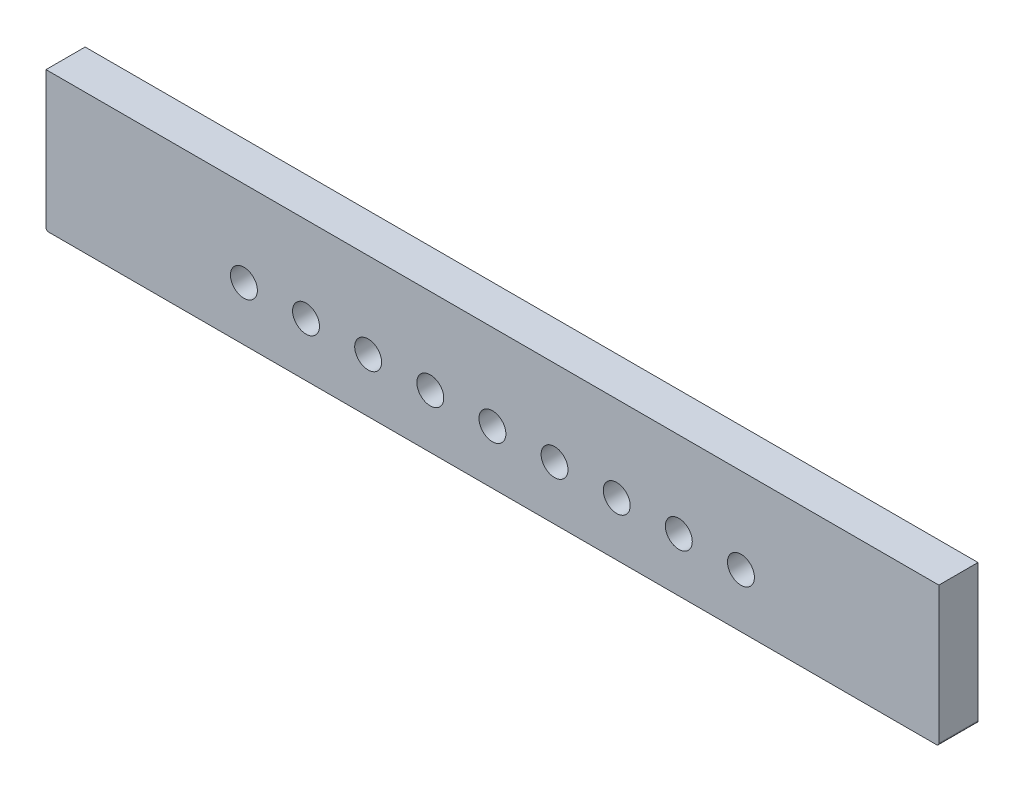
ISO-10303-21;
HEADER;
FILE_DESCRIPTION(('STEP AP214'),'2;1');
FILE_NAME('part.step','',(''),(''),'','','');
FILE_SCHEMA(('AUTOMOTIVE_DESIGN { 1 0 10303 214 1 1 1 1 }'));
ENDSEC;
DATA;
#1=APPLICATION_CONTEXT('core data for automotive mechanical design processes');
#2=APPLICATION_PROTOCOL_DEFINITION('international standard','automotive_design',2000,#1);
#3=PRODUCT_CONTEXT('',#1,'mechanical');
#4=PRODUCT('Part','Part','',(#3));
#5=PRODUCT_RELATED_PRODUCT_CATEGORY('part','',(#4));
#6=PRODUCT_DEFINITION_FORMATION('','',#4);
#7=PRODUCT_DEFINITION_CONTEXT('part definition',#1,'design');
#8=PRODUCT_DEFINITION('design','',#6,#7);
#9=PRODUCT_DEFINITION_SHAPE('','',#8);
#10=(LENGTH_UNIT() NAMED_UNIT(*) SI_UNIT(.MILLI.,.METRE.));
#11=(NAMED_UNIT(*) PLANE_ANGLE_UNIT() SI_UNIT($,.RADIAN.));
#12=(NAMED_UNIT(*) SI_UNIT($,.STERADIAN.) SOLID_ANGLE_UNIT());
#13=UNCERTAINTY_MEASURE_WITH_UNIT(LENGTH_MEASURE(1.E-05),#10,'distance_accuracy_value','');
#14=(GEOMETRIC_REPRESENTATION_CONTEXT(3) GLOBAL_UNCERTAINTY_ASSIGNED_CONTEXT((#13)) GLOBAL_UNIT_ASSIGNED_CONTEXT((#10,
#11,#12)) REPRESENTATION_CONTEXT('',''));
#15=CARTESIAN_POINT('',(0.,0.,0.));
#16=DIRECTION('',(0.,0.,1.));
#17=DIRECTION('',(1.,0.,0.));
#18=AXIS2_PLACEMENT_3D('',#15,#16,#17);
#19=CARTESIAN_POINT('',(-10.16,-35.4,-1.4));
#20=DIRECTION('',(0.,0.,1.));
#21=DIRECTION('',(1.,0.,0.));
#22=AXIS2_PLACEMENT_3D('',#19,#20,#21);
#23=CYLINDRICAL_SURFACE('',#22,0.55);
#24=DIRECTION('',(0.,0.,-1.));
#25=VECTOR('',#24,1.);
#26=CARTESIAN_POINT('',(-9.61,-35.4,-1.4));
#27=LINE('',#26,#25);
#28=CARTESIAN_POINT('',(-9.61,-35.4,-1.4));
#29=VERTEX_POINT('',#28);
#30=CARTESIAN_POINT('',(-9.61,-35.4,-3.));
#31=VERTEX_POINT('',#30);
#32=EDGE_CURVE('E11',#29,#31,#27,.T.);
#33=ORIENTED_EDGE('',*,*,#32,.T.);
#34=CARTESIAN_POINT('',(-10.16,-35.4,-3.));
#35=DIRECTION('',(0.,0.,1.));
#36=DIRECTION('',(1.,0.,0.));
#37=AXIS2_PLACEMENT_3D('',#34,#35,#36);
#38=CIRCLE('',#37,0.55);
#39=EDGE_CURVE('E232',#31,#31,#38,.T.);
#40=ORIENTED_EDGE('',*,*,#39,.F.);
#41=ORIENTED_EDGE('',*,*,#32,.F.);
#42=CARTESIAN_POINT('',(-10.16,-35.4,-1.4));
#43=DIRECTION('',(0.,0.,1.));
#44=DIRECTION('',(1.,0.,0.));
#45=AXIS2_PLACEMENT_3D('',#42,#43,#44);
#46=CIRCLE('',#45,0.55);
#47=EDGE_CURVE('E207',#29,#29,#46,.T.);
#48=ORIENTED_EDGE('',*,*,#47,.T.);
#49=EDGE_LOOP('',(#33,#40,#41,#48));
#50=FACE_BOUND('',#49,.T.);
#51=ADVANCED_FACE('F16',(#50),#23,.F.);
#52=CARTESIAN_POINT('',(-7.62,-35.4,-1.4));
#53=DIRECTION('',(0.,0.,1.));
#54=DIRECTION('',(1.,0.,0.));
#55=AXIS2_PLACEMENT_3D('',#52,#53,#54);
#56=CYLINDRICAL_SURFACE('',#55,0.55);
#57=DIRECTION('',(0.,0.,-1.));
#58=VECTOR('',#57,1.);
#59=CARTESIAN_POINT('',(-7.07,-35.4,-1.4));
#60=LINE('',#59,#58);
#61=CARTESIAN_POINT('',(-7.07,-35.4,-1.4));
#62=VERTEX_POINT('',#61);
#63=CARTESIAN_POINT('',(-7.07,-35.4,-3.));
#64=VERTEX_POINT('',#63);
#65=EDGE_CURVE('E27',#62,#64,#60,.T.);
#66=ORIENTED_EDGE('',*,*,#65,.T.);
#67=CARTESIAN_POINT('',(-7.62,-35.4,-3.));
#68=DIRECTION('',(0.,0.,1.));
#69=DIRECTION('',(1.,0.,0.));
#70=AXIS2_PLACEMENT_3D('',#67,#68,#69);
#71=CIRCLE('',#70,0.55);
#72=EDGE_CURVE('E201',#64,#64,#71,.T.);
#73=ORIENTED_EDGE('',*,*,#72,.F.);
#74=ORIENTED_EDGE('',*,*,#65,.F.);
#75=CARTESIAN_POINT('',(-7.62,-35.4,-1.4));
#76=DIRECTION('',(0.,0.,1.));
#77=DIRECTION('',(1.,0.,0.));
#78=AXIS2_PLACEMENT_3D('',#75,#76,#77);
#79=CIRCLE('',#78,0.55);
#80=EDGE_CURVE('E203',#62,#62,#79,.T.);
#81=ORIENTED_EDGE('',*,*,#80,.T.);
#82=EDGE_LOOP('',(#66,#73,#74,#81));
#83=FACE_BOUND('',#82,.T.);
#84=ADVANCED_FACE('F600',(#83),#56,.F.);
#85=CARTESIAN_POINT('',(7.62,-35.4,-1.4));
#86=DIRECTION('',(0.,0.,1.));
#87=DIRECTION('',(1.,0.,0.));
#88=AXIS2_PLACEMENT_3D('',#85,#86,#87);
#89=CYLINDRICAL_SURFACE('',#88,0.55);
#90=DIRECTION('',(0.,0.,-1.));
#91=VECTOR('',#90,1.);
#92=CARTESIAN_POINT('',(8.17,-35.4,-1.4));
#93=LINE('',#92,#91);
#94=CARTESIAN_POINT('',(8.17,-35.4,-1.4));
#95=VERTEX_POINT('',#94);
#96=CARTESIAN_POINT('',(8.17,-35.4,-3.));
#97=VERTEX_POINT('',#96);
#98=EDGE_CURVE('E193',#95,#97,#93,.T.);
#99=ORIENTED_EDGE('',*,*,#98,.T.);
#100=CARTESIAN_POINT('',(7.62,-35.4,-3.));
#101=DIRECTION('',(0.,0.,1.));
#102=DIRECTION('',(1.,0.,0.));
#103=AXIS2_PLACEMENT_3D('',#100,#101,#102);
#104=CIRCLE('',#103,0.55);
#105=EDGE_CURVE('E197',#97,#97,#104,.T.);
#106=ORIENTED_EDGE('',*,*,#105,.F.);
#107=ORIENTED_EDGE('',*,*,#98,.F.);
#108=CARTESIAN_POINT('',(7.62,-35.4,-1.4));
#109=DIRECTION('',(0.,0.,1.));
#110=DIRECTION('',(1.,0.,0.));
#111=AXIS2_PLACEMENT_3D('',#108,#109,#110);
#112=CIRCLE('',#111,0.55);
#113=EDGE_CURVE('E208',#95,#95,#112,.T.);
#114=ORIENTED_EDGE('',*,*,#113,.T.);
#115=EDGE_LOOP('',(#99,#106,#107,#114));
#116=FACE_BOUND('',#115,.T.);
#117=ADVANCED_FACE('F590',(#116),#89,.F.);
#118=CARTESIAN_POINT('',(5.08,-35.4,-1.4));
#119=DIRECTION('',(0.,0.,1.));
#120=DIRECTION('',(1.,0.,0.));
#121=AXIS2_PLACEMENT_3D('',#118,#119,#120);
#122=CYLINDRICAL_SURFACE('',#121,0.55);
#123=DIRECTION('',(0.,0.,-1.));
#124=VECTOR('',#123,1.);
#125=CARTESIAN_POINT('',(5.63,-35.4,-1.4));
#126=LINE('',#125,#124);
#127=CARTESIAN_POINT('',(5.63,-35.4,-1.4));
#128=VERTEX_POINT('',#127);
#129=CARTESIAN_POINT('',(5.63,-35.4,-3.));
#130=VERTEX_POINT('',#129);
#131=EDGE_CURVE('E196',#128,#130,#126,.T.);
#132=ORIENTED_EDGE('',*,*,#131,.T.);
#133=CARTESIAN_POINT('',(5.08,-35.4,-3.));
#134=DIRECTION('',(0.,0.,1.));
#135=DIRECTION('',(1.,0.,0.));
#136=AXIS2_PLACEMENT_3D('',#133,#134,#135);
#137=CIRCLE('',#136,0.55);
#138=EDGE_CURVE('E202',#130,#130,#137,.T.);
#139=ORIENTED_EDGE('',*,*,#138,.F.);
#140=ORIENTED_EDGE('',*,*,#131,.F.);
#141=CARTESIAN_POINT('',(5.08,-35.4,-1.4));
#142=DIRECTION('',(0.,0.,1.));
#143=DIRECTION('',(1.,0.,0.));
#144=AXIS2_PLACEMENT_3D('',#141,#142,#143);
#145=CIRCLE('',#144,0.55);
#146=EDGE_CURVE('E212',#128,#128,#145,.T.);
#147=ORIENTED_EDGE('',*,*,#146,.T.);
#148=EDGE_LOOP('',(#132,#139,#140,#147));
#149=FACE_BOUND('',#148,.T.);
#150=ADVANCED_FACE('F582',(#149),#122,.F.);
#151=CARTESIAN_POINT('',(10.16,-35.4,-1.4));
#152=DIRECTION('',(0.,0.,1.));
#153=DIRECTION('',(1.,0.,0.));
#154=AXIS2_PLACEMENT_3D('',#151,#152,#153);
#155=CYLINDRICAL_SURFACE('',#154,0.55);
#156=DIRECTION('',(0.,0.,-1.));
#157=VECTOR('',#156,1.);
#158=CARTESIAN_POINT('',(10.71,-35.4,-1.4));
#159=LINE('',#158,#157);
#160=CARTESIAN_POINT('',(10.71,-35.4,-1.4));
#161=VERTEX_POINT('',#160);
#162=CARTESIAN_POINT('',(10.71,-35.4,-3.));
#163=VERTEX_POINT('',#162);
#164=EDGE_CURVE('E119',#161,#163,#159,.T.);
#165=ORIENTED_EDGE('',*,*,#164,.T.);
#166=CARTESIAN_POINT('',(10.16,-35.4,-3.));
#167=DIRECTION('',(0.,0.,1.));
#168=DIRECTION('',(1.,0.,0.));
#169=AXIS2_PLACEMENT_3D('',#166,#167,#168);
#170=CIRCLE('',#169,0.55);
#171=EDGE_CURVE('E241',#163,#163,#170,.T.);
#172=ORIENTED_EDGE('',*,*,#171,.F.);
#173=ORIENTED_EDGE('',*,*,#164,.F.);
#174=CARTESIAN_POINT('',(10.16,-35.4,-1.4));
#175=DIRECTION('',(0.,0.,1.));
#176=DIRECTION('',(1.,0.,0.));
#177=AXIS2_PLACEMENT_3D('',#174,#175,#176);
#178=CIRCLE('',#177,0.55);
#179=EDGE_CURVE('E250',#161,#161,#178,.T.);
#180=ORIENTED_EDGE('',*,*,#179,.T.);
#181=EDGE_LOOP('',(#165,#172,#173,#180));
#182=FACE_BOUND('',#181,.T.);
#183=ADVANCED_FACE('F18',(#182),#155,.F.);
#184=CARTESIAN_POINT('',(0.,-35.4,-1.4));
#185=DIRECTION('',(0.,0.,1.));
#186=DIRECTION('',(1.,0.,0.));
#187=AXIS2_PLACEMENT_3D('',#184,#185,#186);
#188=CYLINDRICAL_SURFACE('',#187,0.55);
#189=DIRECTION('',(0.,0.,-1.));
#190=VECTOR('',#189,1.);
#191=CARTESIAN_POINT('',(0.55,-35.4,-1.4));
#192=LINE('',#191,#190);
#193=CARTESIAN_POINT('',(0.55,-35.4,-1.4));
#194=VERTEX_POINT('',#193);
#195=CARTESIAN_POINT('',(0.55,-35.4,-3.));
#196=VERTEX_POINT('',#195);
#197=EDGE_CURVE('E134',#194,#196,#192,.T.);
#198=ORIENTED_EDGE('',*,*,#197,.T.);
#199=CARTESIAN_POINT('',(0.,-35.4,-3.));
#200=DIRECTION('',(0.,0.,1.));
#201=DIRECTION('',(1.,0.,0.));
#202=AXIS2_PLACEMENT_3D('',#199,#200,#201);
#203=CIRCLE('',#202,0.55);
#204=EDGE_CURVE('E244',#196,#196,#203,.T.);
#205=ORIENTED_EDGE('',*,*,#204,.F.);
#206=ORIENTED_EDGE('',*,*,#197,.F.);
#207=CARTESIAN_POINT('',(0.,-35.4,-1.4));
#208=DIRECTION('',(0.,0.,1.));
#209=DIRECTION('',(1.,0.,0.));
#210=AXIS2_PLACEMENT_3D('',#207,#208,#209);
#211=CIRCLE('',#210,0.55);
#212=EDGE_CURVE('E305',#194,#194,#211,.T.);
#213=ORIENTED_EDGE('',*,*,#212,.T.);
#214=EDGE_LOOP('',(#198,#205,#206,#213));
#215=FACE_BOUND('',#214,.T.);
#216=ADVANCED_FACE('F333',(#215),#188,.F.);
#217=CARTESIAN_POINT('',(2.54,-35.4,-1.4));
#218=DIRECTION('',(0.,0.,1.));
#219=DIRECTION('',(1.,0.,0.));
#220=AXIS2_PLACEMENT_3D('',#217,#218,#219);
#221=CYLINDRICAL_SURFACE('',#220,0.55);
#222=DIRECTION('',(0.,0.,-1.));
#223=VECTOR('',#222,1.);
#224=CARTESIAN_POINT('',(3.09,-35.4,-1.4));
#225=LINE('',#224,#223);
#226=CARTESIAN_POINT('',(3.09,-35.4,-1.4));
#227=VERTEX_POINT('',#226);
#228=CARTESIAN_POINT('',(3.09,-35.4,-3.));
#229=VERTEX_POINT('',#228);
#230=EDGE_CURVE('E222',#227,#229,#225,.T.);
#231=ORIENTED_EDGE('',*,*,#230,.T.);
#232=CARTESIAN_POINT('',(2.54,-35.4,-3.));
#233=DIRECTION('',(0.,0.,1.));
#234=DIRECTION('',(1.,0.,0.));
#235=AXIS2_PLACEMENT_3D('',#232,#233,#234);
#236=CIRCLE('',#235,0.55);
#237=EDGE_CURVE('E281',#229,#229,#236,.T.);
#238=ORIENTED_EDGE('',*,*,#237,.F.);
#239=ORIENTED_EDGE('',*,*,#230,.F.);
#240=CARTESIAN_POINT('',(2.54,-35.4,-1.4));
#241=DIRECTION('',(0.,0.,1.));
#242=DIRECTION('',(1.,0.,0.));
#243=AXIS2_PLACEMENT_3D('',#240,#241,#242);
#244=CIRCLE('',#243,0.55);
#245=EDGE_CURVE('E309',#227,#227,#244,.T.);
#246=ORIENTED_EDGE('',*,*,#245,.T.);
#247=EDGE_LOOP('',(#231,#238,#239,#246));
#248=FACE_BOUND('',#247,.T.);
#249=ADVANCED_FACE('F555',(#248),#221,.F.);
#250=CARTESIAN_POINT('',(-5.08,-35.4,-1.4));
#251=DIRECTION('',(0.,0.,1.));
#252=DIRECTION('',(1.,0.,0.));
#253=AXIS2_PLACEMENT_3D('',#250,#251,#252);
#254=CYLINDRICAL_SURFACE('',#253,0.55);
#255=DIRECTION('',(0.,0.,-1.));
#256=VECTOR('',#255,1.);
#257=CARTESIAN_POINT('',(-4.53,-35.4,-1.4));
#258=LINE('',#257,#256);
#259=CARTESIAN_POINT('',(-4.53,-35.4,-1.4));
#260=VERTEX_POINT('',#259);
#261=CARTESIAN_POINT('',(-4.53,-35.4,-3.));
#262=VERTEX_POINT('',#261);
#263=EDGE_CURVE('E227',#260,#262,#258,.T.);
#264=ORIENTED_EDGE('',*,*,#263,.T.);
#265=CARTESIAN_POINT('',(-5.08,-35.4,-3.));
#266=DIRECTION('',(0.,0.,1.));
#267=DIRECTION('',(1.,0.,0.));
#268=AXIS2_PLACEMENT_3D('',#265,#266,#267);
#269=CIRCLE('',#268,0.55);
#270=EDGE_CURVE('E192',#262,#262,#269,.T.);
#271=ORIENTED_EDGE('',*,*,#270,.F.);
#272=ORIENTED_EDGE('',*,*,#263,.F.);
#273=CARTESIAN_POINT('',(-5.08,-35.4,-1.4));
#274=DIRECTION('',(0.,0.,1.));
#275=DIRECTION('',(1.,0.,0.));
#276=AXIS2_PLACEMENT_3D('',#273,#274,#275);
#277=CIRCLE('',#276,0.55);
#278=EDGE_CURVE('E302',#260,#260,#277,.T.);
#279=ORIENTED_EDGE('',*,*,#278,.T.);
#280=EDGE_LOOP('',(#264,#271,#272,#279));
#281=FACE_BOUND('',#280,.T.);
#282=ADVANCED_FACE('F546',(#281),#254,.F.);
#283=CARTESIAN_POINT('',(-2.54,-35.4,-1.4));
#284=DIRECTION('',(0.,0.,1.));
#285=DIRECTION('',(1.,0.,0.));
#286=AXIS2_PLACEMENT_3D('',#283,#284,#285);
#287=CYLINDRICAL_SURFACE('',#286,0.55);
#288=DIRECTION('',(0.,0.,-1.));
#289=VECTOR('',#288,1.);
#290=CARTESIAN_POINT('',(-1.99,-35.4,-1.4));
#291=LINE('',#290,#289);
#292=CARTESIAN_POINT('',(-1.99,-35.4,-1.4));
#293=VERTEX_POINT('',#292);
#294=CARTESIAN_POINT('',(-1.99,-35.4,-3.));
#295=VERTEX_POINT('',#294);
#296=EDGE_CURVE('E168',#293,#295,#291,.T.);
#297=ORIENTED_EDGE('',*,*,#296,.T.);
#298=CARTESIAN_POINT('',(-2.54,-35.4,-3.));
#299=DIRECTION('',(0.,0.,1.));
#300=DIRECTION('',(1.,0.,0.));
#301=AXIS2_PLACEMENT_3D('',#298,#299,#300);
#302=CIRCLE('',#301,0.55);
#303=EDGE_CURVE('E256',#295,#295,#302,.T.);
#304=ORIENTED_EDGE('',*,*,#303,.F.);
#305=ORIENTED_EDGE('',*,*,#296,.F.);
#306=CARTESIAN_POINT('',(-2.54,-35.4,-1.4));
#307=DIRECTION('',(0.,0.,1.));
#308=DIRECTION('',(1.,0.,0.));
#309=AXIS2_PLACEMENT_3D('',#306,#307,#308);
#310=CIRCLE('',#309,0.55);
#311=EDGE_CURVE('E178',#293,#293,#310,.T.);
#312=ORIENTED_EDGE('',*,*,#311,.T.);
#313=EDGE_LOOP('',(#297,#304,#305,#312));
#314=FACE_BOUND('',#313,.T.);
#315=ADVANCED_FACE('F537',(#314),#287,.F.);
#316=CARTESIAN_POINT('',(18.15,-37.5,-3.));
#317=DIRECTION('',(0.,0.,1.));
#318=DIRECTION('',(1.,0.,0.));
#319=AXIS2_PLACEMENT_3D('',#316,#317,#318);
#320=CYLINDRICAL_SURFACE('',#319,0.1);
#321=DIRECTION('',(0.,0.,1.));
#322=VECTOR('',#321,1.);
#323=CARTESIAN_POINT('',(18.25,-37.5,-3.));
#324=LINE('',#323,#322);
#325=CARTESIAN_POINT('',(18.25,-37.5,-3.));
#326=VERTEX_POINT('',#325);
#327=CARTESIAN_POINT('',(18.25,-37.5,-1.4));
#328=VERTEX_POINT('',#327);
#329=EDGE_CURVE('E155',#326,#328,#324,.T.);
#330=ORIENTED_EDGE('',*,*,#329,.T.);
#331=CARTESIAN_POINT('',(18.15,-37.5,-1.4));
#332=DIRECTION('',(0.,0.,-1.));
#333=DIRECTION('',(0.,-1.,0.));
#334=AXIS2_PLACEMENT_3D('',#331,#332,#333);
#335=CIRCLE('',#334,0.1);
#336=CARTESIAN_POINT('',(18.15,-37.6,-1.4));
#337=VERTEX_POINT('',#336);
#338=EDGE_CURVE('E160',#328,#337,#335,.T.);
#339=ORIENTED_EDGE('',*,*,#338,.T.);
#340=DIRECTION('',(0.,0.,1.));
#341=VECTOR('',#340,1.);
#342=CARTESIAN_POINT('',(18.15,-37.6,-3.));
#343=LINE('',#342,#341);
#344=CARTESIAN_POINT('',(18.15,-37.6,-3.));
#345=VERTEX_POINT('',#344);
#346=EDGE_CURVE('E169',#345,#337,#343,.T.);
#347=ORIENTED_EDGE('',*,*,#346,.F.);
#348=CARTESIAN_POINT('',(18.15,-37.5,-3.));
#349=DIRECTION('',(0.,0.,-1.));
#350=DIRECTION('',(0.,-1.,0.));
#351=AXIS2_PLACEMENT_3D('',#348,#349,#350);
#352=CIRCLE('',#351,0.1);
#353=EDGE_CURVE('E163',#326,#345,#352,.T.);
#354=ORIENTED_EDGE('',*,*,#353,.F.);
#355=EDGE_LOOP('',(#330,#339,#347,#354));
#356=FACE_BOUND('',#355,.T.);
#357=ADVANCED_FACE('F157',(#356),#320,.T.);
#358=CARTESIAN_POINT('',(18.25,-31.9,-3.));
#359=DIRECTION('',(1.,0.,0.));
#360=DIRECTION('',(0.,1.,0.));
#361=AXIS2_PLACEMENT_3D('',#358,#359,#360);
#362=PLANE('',#361);
#363=DIRECTION('',(0.,-1.,0.));
#364=VECTOR('',#363,1.);
#365=CARTESIAN_POINT('',(18.25,-31.9,-3.));
#366=LINE('',#365,#364);
#367=CARTESIAN_POINT('',(18.25,-31.9,-3.));
#368=VERTEX_POINT('',#367);
#369=EDGE_CURVE('E240',#368,#326,#366,.T.);
#370=ORIENTED_EDGE('',*,*,#369,.F.);
#371=DIRECTION('',(0.,0.,1.));
#372=VECTOR('',#371,1.);
#373=CARTESIAN_POINT('',(18.25,-31.9,-3.));
#374=LINE('',#373,#372);
#375=CARTESIAN_POINT('',(18.25,-31.9,-1.4));
#376=VERTEX_POINT('',#375);
#377=EDGE_CURVE('E174',#368,#376,#374,.T.);
#378=ORIENTED_EDGE('',*,*,#377,.T.);
#379=DIRECTION('',(0.,-1.,0.));
#380=VECTOR('',#379,1.);
#381=CARTESIAN_POINT('',(18.25,-31.9,-1.4));
#382=LINE('',#381,#380);
#383=EDGE_CURVE('E172',#376,#328,#382,.T.);
#384=ORIENTED_EDGE('',*,*,#383,.T.);
#385=ORIENTED_EDGE('',*,*,#329,.F.);
#386=EDGE_LOOP('',(#370,#378,#384,#385));
#387=FACE_BOUND('',#386,.T.);
#388=ADVANCED_FACE('F173',(#387),#362,.T.);
#389=CARTESIAN_POINT('',(18.25,-37.6,-3.));
#390=DIRECTION('',(0.,-1.,0.));
#391=DIRECTION('',(0.,0.,-1.));
#392=AXIS2_PLACEMENT_3D('',#389,#390,#391);
#393=PLANE('',#392);
#394=DIRECTION('',(-1.,0.,0.));
#395=VECTOR('',#394,1.);
#396=CARTESIAN_POINT('',(18.25,-37.6,-3.));
#397=LINE('',#396,#395);
#398=CARTESIAN_POINT('',(-18.15,-37.6,-3.));
#399=VERTEX_POINT('',#398);
#400=EDGE_CURVE('E239',#345,#399,#397,.T.);
#401=ORIENTED_EDGE('',*,*,#400,.F.);
#402=ORIENTED_EDGE('',*,*,#346,.T.);
#403=DIRECTION('',(-1.,0.,0.));
#404=VECTOR('',#403,1.);
#405=CARTESIAN_POINT('',(18.25,-37.6,-1.4));
#406=LINE('',#405,#404);
#407=CARTESIAN_POINT('',(-18.15,-37.6,-1.4));
#408=VERTEX_POINT('',#407);
#409=EDGE_CURVE('E182',#337,#408,#406,.T.);
#410=ORIENTED_EDGE('',*,*,#409,.T.);
#411=DIRECTION('',(0.,0.,1.));
#412=VECTOR('',#411,1.);
#413=CARTESIAN_POINT('',(-18.15,-37.6,-3.));
#414=LINE('',#413,#412);
#415=EDGE_CURVE('E236',#399,#408,#414,.T.);
#416=ORIENTED_EDGE('',*,*,#415,.F.);
#417=EDGE_LOOP('',(#401,#402,#410,#416));
#418=FACE_BOUND('',#417,.T.);
#419=ADVANCED_FACE('F323',(#418),#393,.T.);
#420=CARTESIAN_POINT('',(0.,-34.75,-1.4));
#421=DIRECTION('',(0.,0.,-1.));
#422=DIRECTION('',(0.,-1.,0.));
#423=AXIS2_PLACEMENT_3D('',#420,#421,#422);
#424=PLANE('',#423);
#425=ORIENTED_EDGE('',*,*,#47,.F.);
#426=EDGE_LOOP('',(#425));
#427=FACE_BOUND('',#426,.T.);
#428=ORIENTED_EDGE('',*,*,#80,.F.);
#429=EDGE_LOOP('',(#428));
#430=FACE_BOUND('',#429,.T.);
#431=ORIENTED_EDGE('',*,*,#113,.F.);
#432=EDGE_LOOP('',(#431));
#433=FACE_BOUND('',#432,.T.);
#434=ORIENTED_EDGE('',*,*,#146,.F.);
#435=EDGE_LOOP('',(#434));
#436=FACE_BOUND('',#435,.T.);
#437=ORIENTED_EDGE('',*,*,#179,.F.);
#438=EDGE_LOOP('',(#437));
#439=FACE_BOUND('',#438,.T.);
#440=ORIENTED_EDGE('',*,*,#212,.F.);
#441=EDGE_LOOP('',(#440));
#442=FACE_BOUND('',#441,.T.);
#443=ORIENTED_EDGE('',*,*,#245,.F.);
#444=EDGE_LOOP('',(#443));
#445=FACE_BOUND('',#444,.T.);
#446=ORIENTED_EDGE('',*,*,#278,.F.);
#447=EDGE_LOOP('',(#446));
#448=FACE_BOUND('',#447,.T.);
#449=ORIENTED_EDGE('',*,*,#311,.F.);
#450=EDGE_LOOP('',(#449));
#451=FACE_BOUND('',#450,.T.);
#452=CARTESIAN_POINT('',(-18.15,-37.5,-1.4));
#453=DIRECTION('',(0.,0.,1.));
#454=DIRECTION('',(0.,-1.,0.));
#455=AXIS2_PLACEMENT_3D('',#452,#453,#454);
#456=CIRCLE('',#455,0.1);
#457=CARTESIAN_POINT('',(-18.25,-37.5,-1.4));
#458=VERTEX_POINT('',#457);
#459=EDGE_CURVE('E215',#458,#408,#456,.T.);
#460=ORIENTED_EDGE('',*,*,#459,.T.);
#461=ORIENTED_EDGE('',*,*,#409,.F.);
#462=ORIENTED_EDGE('',*,*,#338,.F.);
#463=ORIENTED_EDGE('',*,*,#383,.F.);
#464=DIRECTION('',(1.,0.,0.));
#465=VECTOR('',#464,1.);
#466=CARTESIAN_POINT('',(-18.25,-31.9,-1.4));
#467=LINE('',#466,#465);
#468=CARTESIAN_POINT('',(-18.25,-31.9,-1.4));
#469=VERTEX_POINT('',#468);
#470=EDGE_CURVE('E213',#469,#376,#467,.T.);
#471=ORIENTED_EDGE('',*,*,#470,.F.);
#472=DIRECTION('',(0.,1.,0.));
#473=VECTOR('',#472,1.);
#474=CARTESIAN_POINT('',(-18.25,-37.6,-1.4));
#475=LINE('',#474,#473);
#476=EDGE_CURVE('E286',#458,#469,#475,.T.);
#477=ORIENTED_EDGE('',*,*,#476,.F.);
#478=EDGE_LOOP('',(#460,#461,#462,#463,#471,#477));
#479=FACE_BOUND('',#478,.T.);
#480=ADVANCED_FACE('F181',(#427,#430,#433,#436,#439,#442,#445,#448,#451,#479),#424,.F.);
#481=CARTESIAN_POINT('',(-18.25,-31.9,-3.));
#482=DIRECTION('',(0.,1.,0.));
#483=DIRECTION('',(1.,0.,0.));
#484=AXIS2_PLACEMENT_3D('',#481,#482,#483);
#485=PLANE('',#484);
#486=DIRECTION('',(0.,0.,1.));
#487=VECTOR('',#486,1.);
#488=CARTESIAN_POINT('',(-18.25,-31.9,-3.));
#489=LINE('',#488,#487);
#490=CARTESIAN_POINT('',(-18.25,-31.9,-3.));
#491=VERTEX_POINT('',#490);
#492=EDGE_CURVE('E20',#491,#469,#489,.T.);
#493=ORIENTED_EDGE('',*,*,#492,.T.);
#494=ORIENTED_EDGE('',*,*,#470,.T.);
#495=ORIENTED_EDGE('',*,*,#377,.F.);
#496=DIRECTION('',(1.,0.,0.));
#497=VECTOR('',#496,1.);
#498=CARTESIAN_POINT('',(-18.25,-31.9,-3.));
#499=LINE('',#498,#497);
#500=EDGE_CURVE('E247',#491,#368,#499,.T.);
#501=ORIENTED_EDGE('',*,*,#500,.F.);
#502=EDGE_LOOP('',(#493,#494,#495,#501));
#503=FACE_BOUND('',#502,.T.);
#504=ADVANCED_FACE('F485',(#503),#485,.T.);
#505=CARTESIAN_POINT('',(-18.15,-37.5,-3.));
#506=DIRECTION('',(0.,0.,1.));
#507=DIRECTION('',(-1.,0.,0.));
#508=AXIS2_PLACEMENT_3D('',#505,#506,#507);
#509=CYLINDRICAL_SURFACE('',#508,0.1);
#510=CARTESIAN_POINT('',(-18.15,-37.5,-3.));
#511=DIRECTION('',(0.,0.,1.));
#512=DIRECTION('',(0.,-1.,0.));
#513=AXIS2_PLACEMENT_3D('',#510,#511,#512);
#514=CIRCLE('',#513,0.1);
#515=CARTESIAN_POINT('',(-18.25,-37.5,-3.));
#516=VERTEX_POINT('',#515);
#517=EDGE_CURVE('E252',#516,#399,#514,.T.);
#518=ORIENTED_EDGE('',*,*,#517,.T.);
#519=ORIENTED_EDGE('',*,*,#415,.T.);
#520=ORIENTED_EDGE('',*,*,#459,.F.);
#521=DIRECTION('',(0.,0.,1.));
#522=VECTOR('',#521,1.);
#523=CARTESIAN_POINT('',(-18.25,-37.5,-3.));
#524=LINE('',#523,#522);
#525=EDGE_CURVE('E282',#516,#458,#524,.T.);
#526=ORIENTED_EDGE('',*,*,#525,.F.);
#527=EDGE_LOOP('',(#518,#519,#520,#526));
#528=FACE_BOUND('',#527,.T.);
#529=ADVANCED_FACE('F340',(#528),#509,.T.);
#530=CARTESIAN_POINT('',(0.,-34.75,-3.));
#531=DIRECTION('',(0.,0.,-1.));
#532=DIRECTION('',(0.,-1.,0.));
#533=AXIS2_PLACEMENT_3D('',#530,#531,#532);
#534=PLANE('',#533);
#535=ORIENTED_EDGE('',*,*,#39,.T.);
#536=EDGE_LOOP('',(#535));
#537=FACE_BOUND('',#536,.T.);
#538=ORIENTED_EDGE('',*,*,#72,.T.);
#539=EDGE_LOOP('',(#538));
#540=FACE_BOUND('',#539,.T.);
#541=ORIENTED_EDGE('',*,*,#105,.T.);
#542=EDGE_LOOP('',(#541));
#543=FACE_BOUND('',#542,.T.);
#544=ORIENTED_EDGE('',*,*,#138,.T.);
#545=EDGE_LOOP('',(#544));
#546=FACE_BOUND('',#545,.T.);
#547=ORIENTED_EDGE('',*,*,#171,.T.);
#548=EDGE_LOOP('',(#547));
#549=FACE_BOUND('',#548,.T.);
#550=ORIENTED_EDGE('',*,*,#204,.T.);
#551=EDGE_LOOP('',(#550));
#552=FACE_BOUND('',#551,.T.);
#553=ORIENTED_EDGE('',*,*,#237,.T.);
#554=EDGE_LOOP('',(#553));
#555=FACE_BOUND('',#554,.T.);
#556=ORIENTED_EDGE('',*,*,#270,.T.);
#557=EDGE_LOOP('',(#556));
#558=FACE_BOUND('',#557,.T.);
#559=ORIENTED_EDGE('',*,*,#303,.T.);
#560=EDGE_LOOP('',(#559));
#561=FACE_BOUND('',#560,.T.);
#562=DIRECTION('',(0.,1.,0.));
#563=VECTOR('',#562,1.);
#564=CARTESIAN_POINT('',(-18.25,-37.6,-3.));
#565=LINE('',#564,#563);
#566=EDGE_CURVE('E231',#516,#491,#565,.T.);
#567=ORIENTED_EDGE('',*,*,#566,.T.);
#568=ORIENTED_EDGE('',*,*,#500,.T.);
#569=ORIENTED_EDGE('',*,*,#369,.T.);
#570=ORIENTED_EDGE('',*,*,#353,.T.);
#571=ORIENTED_EDGE('',*,*,#400,.T.);
#572=ORIENTED_EDGE('',*,*,#517,.F.);
#573=EDGE_LOOP('',(#567,#568,#569,#570,#571,#572));
#574=FACE_BOUND('',#573,.T.);
#575=ADVANCED_FACE('F336',(#537,#540,#543,#546,#549,#552,#555,#558,#561,#574),#534,.T.);
#576=CARTESIAN_POINT('',(-18.25,-37.6,-3.));
#577=DIRECTION('',(-1.,0.,0.));
#578=DIRECTION('',(0.,0.,1.));
#579=AXIS2_PLACEMENT_3D('',#576,#577,#578);
#580=PLANE('',#579);
#581=ORIENTED_EDGE('',*,*,#566,.F.);
#582=ORIENTED_EDGE('',*,*,#525,.T.);
#583=ORIENTED_EDGE('',*,*,#476,.T.);
#584=ORIENTED_EDGE('',*,*,#492,.F.);
#585=EDGE_LOOP('',(#581,#582,#583,#584));
#586=FACE_BOUND('',#585,.T.);
#587=ADVANCED_FACE('F339',(#586),#580,.T.);
#588=CLOSED_SHELL('',(#51,#84,#117,#150,#183,#216,#249,#282,#315,#357,#388,#419,#480,#504,#529,
#575,#587));
#589=MANIFOLD_SOLID_BREP('B1',#588);
#590=ADVANCED_BREP_SHAPE_REPRESENTATION('',(#18,#589),#14);
#591=SHAPE_DEFINITION_REPRESENTATION(#9,#590);
ENDSEC;
END-ISO-10303-21;
